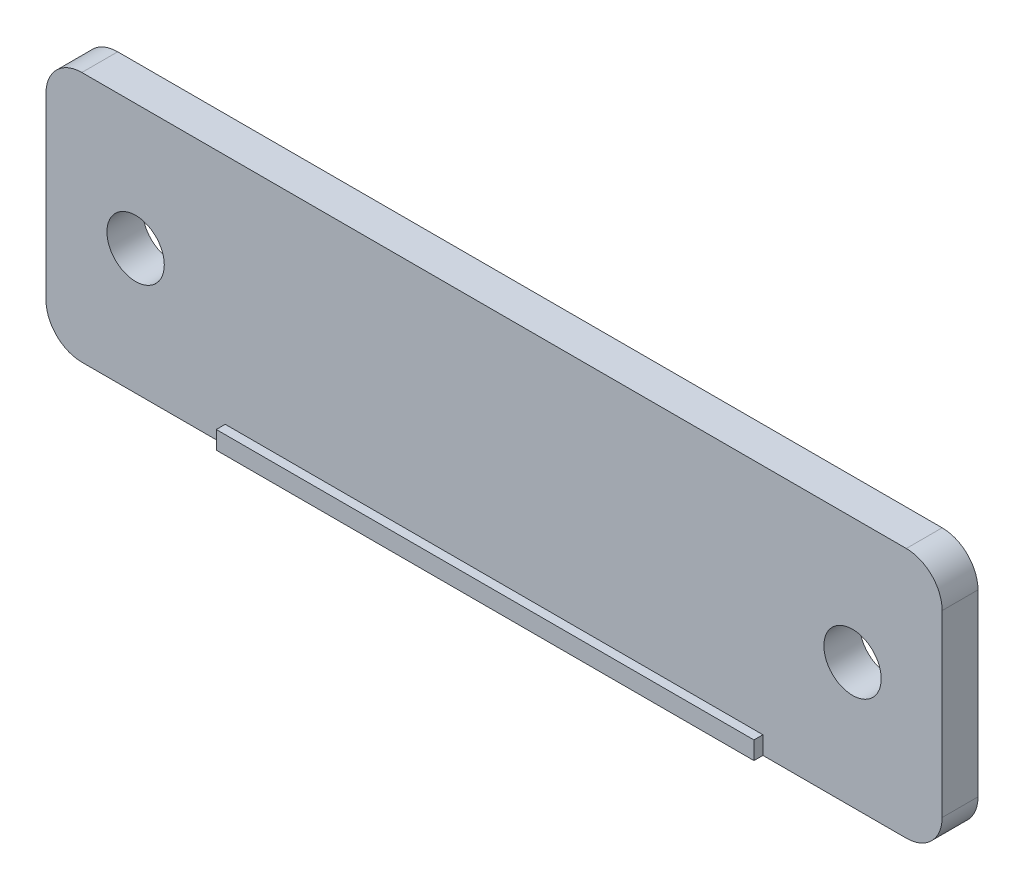
ISO-10303-21;
HEADER;
FILE_DESCRIPTION(('STEP AP214'),'2;1');
FILE_NAME('part.step','',(''),(''),'','','');
FILE_SCHEMA(('AUTOMOTIVE_DESIGN { 1 0 10303 214 1 1 1 1 }'));
ENDSEC;
DATA;
#1=APPLICATION_CONTEXT('core data for automotive mechanical design processes');
#2=APPLICATION_PROTOCOL_DEFINITION('international standard','automotive_design',2000,#1);
#3=PRODUCT_CONTEXT('',#1,'mechanical');
#4=PRODUCT('Part','Part','',(#3));
#5=PRODUCT_RELATED_PRODUCT_CATEGORY('part','',(#4));
#6=PRODUCT_DEFINITION_FORMATION('','',#4);
#7=PRODUCT_DEFINITION_CONTEXT('part definition',#1,'design');
#8=PRODUCT_DEFINITION('design','',#6,#7);
#9=PRODUCT_DEFINITION_SHAPE('','',#8);
#10=(LENGTH_UNIT() NAMED_UNIT(*) SI_UNIT(.MILLI.,.METRE.));
#11=(NAMED_UNIT(*) PLANE_ANGLE_UNIT() SI_UNIT($,.RADIAN.));
#12=(NAMED_UNIT(*) SI_UNIT($,.STERADIAN.) SOLID_ANGLE_UNIT());
#13=UNCERTAINTY_MEASURE_WITH_UNIT(LENGTH_MEASURE(1.E-05),#10,'distance_accuracy_value','');
#14=(GEOMETRIC_REPRESENTATION_CONTEXT(3) GLOBAL_UNCERTAINTY_ASSIGNED_CONTEXT((#13)) GLOBAL_UNIT_ASSIGNED_CONTEXT((#10,
#11,#12)) REPRESENTATION_CONTEXT('',''));
#15=CARTESIAN_POINT('',(0.,0.,0.));
#16=DIRECTION('',(0.,0.,1.));
#17=DIRECTION('',(1.,0.,0.));
#18=AXIS2_PLACEMENT_3D('',#15,#16,#17);
#19=CARTESIAN_POINT('',(25.,-6.99999999999999,2.5));
#20=DIRECTION('',(-1.,0.,0.));
#21=DIRECTION('',(0.,0.,1.));
#22=AXIS2_PLACEMENT_3D('',#19,#20,#21);
#23=PLANE('',#22);
#24=DIRECTION('',(0.,1.,0.));
#25=VECTOR('',#24,1.);
#26=CARTESIAN_POINT('',(25.,-6.99999999999999,2.));
#27=LINE('',#26,#25);
#28=CARTESIAN_POINT('',(25.,-4.99999999999999,2.));
#29=VERTEX_POINT('',#28);
#30=CARTESIAN_POINT('',(25.,4.99999999999999,2.));
#31=VERTEX_POINT('',#30);
#32=EDGE_CURVE('E162',#29,#31,#27,.T.);
#33=ORIENTED_EDGE('',*,*,#32,.F.);
#34=DIRECTION('',(0.,0.,-1.));
#35=VECTOR('',#34,1.);
#36=CARTESIAN_POINT('',(25.,-4.99999999999999,2.5));
#37=LINE('',#36,#35);
#38=CARTESIAN_POINT('',(25.,-4.99999999999999,0.));
#39=VERTEX_POINT('',#38);
#40=EDGE_CURVE('E215',#29,#39,#37,.T.);
#41=ORIENTED_EDGE('',*,*,#40,.T.);
#42=DIRECTION('',(0.,1.,0.));
#43=VECTOR('',#42,1.);
#44=CARTESIAN_POINT('',(25.,-6.99999999999999,0.));
#45=LINE('',#44,#43);
#46=CARTESIAN_POINT('',(25.,4.99999999999999,0.));
#47=VERTEX_POINT('',#46);
#48=EDGE_CURVE('E172',#39,#47,#45,.T.);
#49=ORIENTED_EDGE('',*,*,#48,.T.);
#50=DIRECTION('',(0.,0.,-1.));
#51=VECTOR('',#50,1.);
#52=CARTESIAN_POINT('',(25.,4.99999999999999,2.5));
#53=LINE('',#52,#51);
#54=EDGE_CURVE('E213',#47,#31,#53,.F.);
#55=ORIENTED_EDGE('',*,*,#54,.T.);
#56=EDGE_LOOP('',(#33,#41,#49,#55));
#57=FACE_BOUND('',#56,.T.);
#58=ADVANCED_FACE('F33',(#57),#23,.F.);
#59=CARTESIAN_POINT('',(-25.,6.99999999999999,2.5));
#60=DIRECTION('',(0.,-1.,0.));
#61=DIRECTION('',(1.,0.,0.));
#62=AXIS2_PLACEMENT_3D('',#59,#60,#61);
#63=PLANE('',#62);
#64=DIRECTION('',(-1.,0.,0.));
#65=VECTOR('',#64,1.);
#66=CARTESIAN_POINT('',(-25.,6.99999999999999,2.));
#67=LINE('',#66,#65);
#68=CARTESIAN_POINT('',(23.,6.99999999999999,2.));
#69=VERTEX_POINT('',#68);
#70=CARTESIAN_POINT('',(-23.,6.99999999999999,2.));
#71=VERTEX_POINT('',#70);
#72=EDGE_CURVE('E168',#69,#71,#67,.T.);
#73=ORIENTED_EDGE('',*,*,#72,.F.);
#74=DIRECTION('',(0.,0.,-1.));
#75=VECTOR('',#74,1.);
#76=CARTESIAN_POINT('',(23.,6.99999999999999,2.5));
#77=LINE('',#76,#75);
#78=CARTESIAN_POINT('',(23.,6.99999999999999,0.));
#79=VERTEX_POINT('',#78);
#80=EDGE_CURVE('E12',#69,#79,#77,.T.);
#81=ORIENTED_EDGE('',*,*,#80,.T.);
#82=DIRECTION('',(-1.,0.,0.));
#83=VECTOR('',#82,1.);
#84=CARTESIAN_POINT('',(-25.,6.99999999999999,0.));
#85=LINE('',#84,#83);
#86=CARTESIAN_POINT('',(-23.,6.99999999999999,0.));
#87=VERTEX_POINT('',#86);
#88=EDGE_CURVE('E180',#79,#87,#85,.T.);
#89=ORIENTED_EDGE('',*,*,#88,.T.);
#90=DIRECTION('',(0.,0.,-1.));
#91=VECTOR('',#90,1.);
#92=CARTESIAN_POINT('',(-23.,6.99999999999999,2.5));
#93=LINE('',#92,#91);
#94=EDGE_CURVE('E41',#87,#71,#93,.F.);
#95=ORIENTED_EDGE('',*,*,#94,.T.);
#96=EDGE_LOOP('',(#73,#81,#89,#95));
#97=FACE_BOUND('',#96,.T.);
#98=ADVANCED_FACE('F231',(#97),#63,.F.);
#99=CARTESIAN_POINT('',(-25.,-7.,2.5));
#100=DIRECTION('',(1.,0.,0.));
#101=DIRECTION('',(0.,0.,-1.));
#102=AXIS2_PLACEMENT_3D('',#99,#100,#101);
#103=PLANE('',#102);
#104=DIRECTION('',(0.,-1.,0.));
#105=VECTOR('',#104,1.);
#106=CARTESIAN_POINT('',(-25.,-7.,0.));
#107=LINE('',#106,#105);
#108=CARTESIAN_POINT('',(-25.,4.99999999999999,0.));
#109=VERTEX_POINT('',#108);
#110=CARTESIAN_POINT('',(-25.,-5.,0.));
#111=VERTEX_POINT('',#110);
#112=EDGE_CURVE('E182',#109,#111,#107,.T.);
#113=ORIENTED_EDGE('',*,*,#112,.T.);
#114=DIRECTION('',(0.,0.,-1.));
#115=VECTOR('',#114,1.);
#116=CARTESIAN_POINT('',(-25.,-5.,2.5));
#117=LINE('',#116,#115);
#118=CARTESIAN_POINT('',(-25.,-5.,2.));
#119=VERTEX_POINT('',#118);
#120=EDGE_CURVE('E204',#111,#119,#117,.F.);
#121=ORIENTED_EDGE('',*,*,#120,.T.);
#122=DIRECTION('',(0.,-1.,0.));
#123=VECTOR('',#122,1.);
#124=CARTESIAN_POINT('',(-25.,-7.,2.));
#125=LINE('',#124,#123);
#126=CARTESIAN_POINT('',(-25.,4.99999999999999,2.));
#127=VERTEX_POINT('',#126);
#128=EDGE_CURVE('E170',#127,#119,#125,.T.);
#129=ORIENTED_EDGE('',*,*,#128,.F.);
#130=DIRECTION('',(0.,0.,-1.));
#131=VECTOR('',#130,1.);
#132=CARTESIAN_POINT('',(-25.,4.99999999999999,2.5));
#133=LINE('',#132,#131);
#134=EDGE_CURVE('E201',#127,#109,#133,.T.);
#135=ORIENTED_EDGE('',*,*,#134,.T.);
#136=EDGE_LOOP('',(#113,#121,#129,#135));
#137=FACE_BOUND('',#136,.T.);
#138=ADVANCED_FACE('F238',(#137),#103,.F.);
#139=CARTESIAN_POINT('',(-25.,-7.,2.5));
#140=DIRECTION('',(0.,1.,0.));
#141=DIRECTION('',(-1.,0.,0.));
#142=AXIS2_PLACEMENT_3D('',#139,#140,#141);
#143=PLANE('',#142);
#144=DIRECTION('',(1.,0.,0.));
#145=VECTOR('',#144,1.);
#146=CARTESIAN_POINT('',(-25.,-7.,2.));
#147=LINE('',#146,#145);
#148=CARTESIAN_POINT('',(-23.,-7.,2.));
#149=VERTEX_POINT('',#148);
#150=CARTESIAN_POINT('',(-15.,-7.,2.));
#151=VERTEX_POINT('',#150);
#152=EDGE_CURVE('E144',#149,#151,#147,.T.);
#153=ORIENTED_EDGE('',*,*,#152,.F.);
#154=DIRECTION('',(0.,0.,-1.));
#155=VECTOR('',#154,1.);
#156=CARTESIAN_POINT('',(-23.,-7.,2.5));
#157=LINE('',#156,#155);
#158=CARTESIAN_POINT('',(-23.,-7.,0.));
#159=VERTEX_POINT('',#158);
#160=EDGE_CURVE('E190',#149,#159,#157,.T.);
#161=ORIENTED_EDGE('',*,*,#160,.T.);
#162=DIRECTION('',(1.,0.,0.));
#163=VECTOR('',#162,1.);
#164=CARTESIAN_POINT('',(-25.,-7.,0.));
#165=LINE('',#164,#163);
#166=CARTESIAN_POINT('',(23.,-6.99999999999999,0.));
#167=VERTEX_POINT('',#166);
#168=EDGE_CURVE('E177',#159,#167,#165,.T.);
#169=ORIENTED_EDGE('',*,*,#168,.T.);
#170=DIRECTION('',(0.,0.,-1.));
#171=VECTOR('',#170,1.);
#172=CARTESIAN_POINT('',(23.,-6.99999999999999,2.5));
#173=LINE('',#172,#171);
#174=CARTESIAN_POINT('',(23.,-6.99999999999999,2.));
#175=VERTEX_POINT('',#174);
#176=EDGE_CURVE('E188',#167,#175,#173,.F.);
#177=ORIENTED_EDGE('',*,*,#176,.T.);
#178=CARTESIAN_POINT('',(15.,-6.99999999999999,2.));
#179=VERTEX_POINT('',#178);
#180=EDGE_CURVE('E176',#179,#175,#147,.T.);
#181=ORIENTED_EDGE('',*,*,#180,.F.);
#182=DIRECTION('',(0.,0.,1.));
#183=VECTOR('',#182,1.);
#184=CARTESIAN_POINT('',(15.,-6.99999999999999,2.));
#185=LINE('',#184,#183);
#186=CARTESIAN_POINT('',(15.,-6.99999999999999,2.5));
#187=VERTEX_POINT('',#186);
#188=EDGE_CURVE('E163',#179,#187,#185,.T.);
#189=ORIENTED_EDGE('',*,*,#188,.T.);
#190=DIRECTION('',(1.,0.,0.));
#191=VECTOR('',#190,1.);
#192=CARTESIAN_POINT('',(-25.,-7.,2.5));
#193=LINE('',#192,#191);
#194=CARTESIAN_POINT('',(-15.,-7.,2.5));
#195=VERTEX_POINT('',#194);
#196=EDGE_CURVE('E173',#195,#187,#193,.T.);
#197=ORIENTED_EDGE('',*,*,#196,.F.);
#198=DIRECTION('',(0.,0.,1.));
#199=VECTOR('',#198,1.);
#200=CARTESIAN_POINT('',(-15.,-7.,2.));
#201=LINE('',#200,#199);
#202=EDGE_CURVE('E134',#151,#195,#201,.T.);
#203=ORIENTED_EDGE('',*,*,#202,.F.);
#204=EDGE_LOOP('',(#153,#161,#169,#177,#181,#189,#197,#203));
#205=FACE_BOUND('',#204,.T.);
#206=ADVANCED_FACE('F245',(#205),#143,.F.);
#207=CARTESIAN_POINT('',(0.,0.,2.5));
#208=DIRECTION('',(0.,0.,-1.));
#209=DIRECTION('',(-1.,0.,0.));
#210=AXIS2_PLACEMENT_3D('',#207,#208,#209);
#211=PLANE('',#210);
#212=DIRECTION('',(0.,1.,0.));
#213=VECTOR('',#212,1.);
#214=CARTESIAN_POINT('',(15.,-6.,2.5));
#215=LINE('',#214,#213);
#216=CARTESIAN_POINT('',(15.,-6.,2.5));
#217=VERTEX_POINT('',#216);
#218=EDGE_CURVE('E148',#187,#217,#215,.T.);
#219=ORIENTED_EDGE('',*,*,#218,.T.);
#220=DIRECTION('',(-1.,0.,0.));
#221=VECTOR('',#220,1.);
#222=CARTESIAN_POINT('',(15.,-6.,2.5));
#223=LINE('',#222,#221);
#224=CARTESIAN_POINT('',(-15.,-6.,2.5));
#225=VERTEX_POINT('',#224);
#226=EDGE_CURVE('E157',#217,#225,#223,.T.);
#227=ORIENTED_EDGE('',*,*,#226,.T.);
#228=DIRECTION('',(0.,-1.,0.));
#229=VECTOR('',#228,1.);
#230=CARTESIAN_POINT('',(-15.,-6.,2.5));
#231=LINE('',#230,#229);
#232=EDGE_CURVE('E129',#225,#195,#231,.T.);
#233=ORIENTED_EDGE('',*,*,#232,.T.);
#234=ORIENTED_EDGE('',*,*,#196,.T.);
#235=EDGE_LOOP('',(#219,#227,#233,#234));
#236=FACE_BOUND('',#235,.T.);
#237=ADVANCED_FACE('F249',(#236),#211,.F.);
#238=CARTESIAN_POINT('',(0.,0.,0.));
#239=DIRECTION('',(0.,0.,-1.));
#240=DIRECTION('',(-1.,0.,0.));
#241=AXIS2_PLACEMENT_3D('',#238,#239,#240);
#242=PLANE('',#241);
#243=CARTESIAN_POINT('',(-20.,0.,0.));
#244=DIRECTION('',(0.,0.,1.));
#245=DIRECTION('',(1.,0.,0.));
#246=AXIS2_PLACEMENT_3D('',#243,#244,#245);
#247=CIRCLE('',#246,1.6);
#248=CARTESIAN_POINT('',(-18.4,0.,0.));
#249=VERTEX_POINT('',#248);
#250=EDGE_CURVE('E159',#249,#249,#247,.T.);
#251=ORIENTED_EDGE('',*,*,#250,.T.);
#252=EDGE_LOOP('',(#251));
#253=FACE_BOUND('',#252,.T.);
#254=CARTESIAN_POINT('',(20.,0.,0.));
#255=DIRECTION('',(0.,0.,1.));
#256=DIRECTION('',(1.,0.,0.));
#257=AXIS2_PLACEMENT_3D('',#254,#255,#256);
#258=CIRCLE('',#257,1.6);
#259=CARTESIAN_POINT('',(21.6,0.,0.));
#260=VERTEX_POINT('',#259);
#261=EDGE_CURVE('E302',#260,#260,#258,.T.);
#262=ORIENTED_EDGE('',*,*,#261,.T.);
#263=EDGE_LOOP('',(#262));
#264=FACE_BOUND('',#263,.T.);
#265=ORIENTED_EDGE('',*,*,#168,.F.);
#266=CARTESIAN_POINT('',(-23.,-5.,0.));
#267=DIRECTION('',(0.,0.,-1.));
#268=DIRECTION('',(-1.,0.,0.));
#269=AXIS2_PLACEMENT_3D('',#266,#267,#268);
#270=CIRCLE('',#269,2.);
#271=EDGE_CURVE('E199',#159,#111,#270,.T.);
#272=ORIENTED_EDGE('',*,*,#271,.T.);
#273=ORIENTED_EDGE('',*,*,#112,.F.);
#274=CARTESIAN_POINT('',(-23.,4.99999999999999,0.));
#275=DIRECTION('',(0.,0.,-1.));
#276=DIRECTION('',(-1.,0.,0.));
#277=AXIS2_PLACEMENT_3D('',#274,#275,#276);
#278=CIRCLE('',#277,2.);
#279=EDGE_CURVE('E193',#109,#87,#278,.T.);
#280=ORIENTED_EDGE('',*,*,#279,.T.);
#281=ORIENTED_EDGE('',*,*,#88,.F.);
#282=CARTESIAN_POINT('',(23.,4.99999999999999,0.));
#283=DIRECTION('',(0.,0.,-1.));
#284=DIRECTION('',(-1.,0.,0.));
#285=AXIS2_PLACEMENT_3D('',#282,#283,#284);
#286=CIRCLE('',#285,2.);
#287=EDGE_CURVE('E195',#79,#47,#286,.T.);
#288=ORIENTED_EDGE('',*,*,#287,.T.);
#289=ORIENTED_EDGE('',*,*,#48,.F.);
#290=CARTESIAN_POINT('',(23.,-4.99999999999999,0.));
#291=DIRECTION('',(0.,0.,-1.));
#292=DIRECTION('',(-1.,0.,0.));
#293=AXIS2_PLACEMENT_3D('',#290,#291,#292);
#294=CIRCLE('',#293,2.);
#295=EDGE_CURVE('E197',#39,#167,#294,.T.);
#296=ORIENTED_EDGE('',*,*,#295,.T.);
#297=EDGE_LOOP('',(#265,#272,#273,#280,#281,#288,#289,#296));
#298=FACE_BOUND('',#297,.T.);
#299=ADVANCED_FACE('F226',(#253,#264,#298),#242,.T.);
#300=CARTESIAN_POINT('',(0.,0.,2.));
#301=DIRECTION('',(0.,0.,1.));
#302=DIRECTION('',(1.,0.,0.));
#303=AXIS2_PLACEMENT_3D('',#300,#301,#302);
#304=PLANE('',#303);
#305=CARTESIAN_POINT('',(-20.,0.,2.));
#306=DIRECTION('',(0.,0.,1.));
#307=DIRECTION('',(1.,0.,0.));
#308=AXIS2_PLACEMENT_3D('',#305,#306,#307);
#309=CIRCLE('',#308,1.6);
#310=CARTESIAN_POINT('',(-18.4,0.,2.));
#311=VERTEX_POINT('',#310);
#312=EDGE_CURVE('E301',#311,#311,#309,.T.);
#313=ORIENTED_EDGE('',*,*,#312,.F.);
#314=EDGE_LOOP('',(#313));
#315=FACE_BOUND('',#314,.T.);
#316=CARTESIAN_POINT('',(20.,0.,2.));
#317=DIRECTION('',(0.,0.,1.));
#318=DIRECTION('',(1.,0.,0.));
#319=AXIS2_PLACEMENT_3D('',#316,#317,#318);
#320=CIRCLE('',#319,1.6);
#321=CARTESIAN_POINT('',(21.6,0.,2.));
#322=VERTEX_POINT('',#321);
#323=EDGE_CURVE('E153',#322,#322,#320,.T.);
#324=ORIENTED_EDGE('',*,*,#323,.F.);
#325=EDGE_LOOP('',(#324));
#326=FACE_BOUND('',#325,.T.);
#327=ORIENTED_EDGE('',*,*,#128,.T.);
#328=CARTESIAN_POINT('',(-23.,-5.,2.));
#329=DIRECTION('',(0.,0.,1.));
#330=DIRECTION('',(1.,0.,0.));
#331=AXIS2_PLACEMENT_3D('',#328,#329,#330);
#332=CIRCLE('',#331,2.);
#333=EDGE_CURVE('E211',#119,#149,#332,.T.);
#334=ORIENTED_EDGE('',*,*,#333,.T.);
#335=ORIENTED_EDGE('',*,*,#152,.T.);
#336=DIRECTION('',(0.,-1.,0.));
#337=VECTOR('',#336,1.);
#338=CARTESIAN_POINT('',(-15.,-6.,2.));
#339=LINE('',#338,#337);
#340=CARTESIAN_POINT('',(-15.,-6.,2.));
#341=VERTEX_POINT('',#340);
#342=EDGE_CURVE('E126',#341,#151,#339,.T.);
#343=ORIENTED_EDGE('',*,*,#342,.F.);
#344=DIRECTION('',(-1.,0.,0.));
#345=VECTOR('',#344,1.);
#346=CARTESIAN_POINT('',(15.,-6.,2.));
#347=LINE('',#346,#345);
#348=CARTESIAN_POINT('',(15.,-6.,2.));
#349=VERTEX_POINT('',#348);
#350=EDGE_CURVE('E141',#349,#341,#347,.T.);
#351=ORIENTED_EDGE('',*,*,#350,.F.);
#352=DIRECTION('',(0.,1.,0.));
#353=VECTOR('',#352,1.);
#354=CARTESIAN_POINT('',(15.,-6.,2.));
#355=LINE('',#354,#353);
#356=EDGE_CURVE('E135',#179,#349,#355,.T.);
#357=ORIENTED_EDGE('',*,*,#356,.F.);
#358=ORIENTED_EDGE('',*,*,#180,.T.);
#359=CARTESIAN_POINT('',(23.,-4.99999999999999,2.));
#360=DIRECTION('',(0.,0.,1.));
#361=DIRECTION('',(1.,0.,0.));
#362=AXIS2_PLACEMENT_3D('',#359,#360,#361);
#363=CIRCLE('',#362,2.);
#364=EDGE_CURVE('E209',#175,#29,#363,.T.);
#365=ORIENTED_EDGE('',*,*,#364,.T.);
#366=ORIENTED_EDGE('',*,*,#32,.T.);
#367=CARTESIAN_POINT('',(23.,4.99999999999999,2.));
#368=DIRECTION('',(0.,0.,1.));
#369=DIRECTION('',(1.,0.,0.));
#370=AXIS2_PLACEMENT_3D('',#367,#368,#369);
#371=CIRCLE('',#370,2.);
#372=EDGE_CURVE('E54',#31,#69,#371,.T.);
#373=ORIENTED_EDGE('',*,*,#372,.T.);
#374=ORIENTED_EDGE('',*,*,#72,.T.);
#375=CARTESIAN_POINT('',(-23.,4.99999999999999,2.));
#376=DIRECTION('',(0.,0.,1.));
#377=DIRECTION('',(1.,0.,0.));
#378=AXIS2_PLACEMENT_3D('',#375,#376,#377);
#379=CIRCLE('',#378,2.);
#380=EDGE_CURVE('E206',#71,#127,#379,.T.);
#381=ORIENTED_EDGE('',*,*,#380,.T.);
#382=EDGE_LOOP('',(#327,#334,#335,#343,#351,#357,#358,#365,#366,#373,#374,#381));
#383=FACE_BOUND('',#382,.T.);
#384=ADVANCED_FACE('F139',(#315,#326,#383),#304,.T.);
#385=CARTESIAN_POINT('',(15.,-6.,2.));
#386=DIRECTION('',(0.,1.,0.));
#387=DIRECTION('',(-1.,0.,0.));
#388=AXIS2_PLACEMENT_3D('',#385,#386,#387);
#389=PLANE('',#388);
#390=ORIENTED_EDGE('',*,*,#226,.F.);
#391=DIRECTION('',(0.,0.,1.));
#392=VECTOR('',#391,1.);
#393=CARTESIAN_POINT('',(15.,-6.,2.));
#394=LINE('',#393,#392);
#395=EDGE_CURVE('E147',#349,#217,#394,.T.);
#396=ORIENTED_EDGE('',*,*,#395,.F.);
#397=ORIENTED_EDGE('',*,*,#350,.T.);
#398=DIRECTION('',(0.,0.,1.));
#399=VECTOR('',#398,1.);
#400=CARTESIAN_POINT('',(-15.,-6.,2.));
#401=LINE('',#400,#399);
#402=EDGE_CURVE('E123',#341,#225,#401,.T.);
#403=ORIENTED_EDGE('',*,*,#402,.T.);
#404=EDGE_LOOP('',(#390,#396,#397,#403));
#405=FACE_BOUND('',#404,.T.);
#406=ADVANCED_FACE('F146',(#405),#389,.T.);
#407=CARTESIAN_POINT('',(15.,-6.,2.));
#408=DIRECTION('',(1.,0.,0.));
#409=DIRECTION('',(0.,0.,-1.));
#410=AXIS2_PLACEMENT_3D('',#407,#408,#409);
#411=PLANE('',#410);
#412=ORIENTED_EDGE('',*,*,#218,.F.);
#413=ORIENTED_EDGE('',*,*,#188,.F.);
#414=ORIENTED_EDGE('',*,*,#356,.T.);
#415=ORIENTED_EDGE('',*,*,#395,.T.);
#416=EDGE_LOOP('',(#412,#413,#414,#415));
#417=FACE_BOUND('',#416,.T.);
#418=ADVANCED_FACE('F251',(#417),#411,.T.);
#419=CARTESIAN_POINT('',(-15.,-6.,2.));
#420=DIRECTION('',(-1.,0.,0.));
#421=DIRECTION('',(0.,0.,1.));
#422=AXIS2_PLACEMENT_3D('',#419,#420,#421);
#423=PLANE('',#422);
#424=ORIENTED_EDGE('',*,*,#232,.F.);
#425=ORIENTED_EDGE('',*,*,#402,.F.);
#426=ORIENTED_EDGE('',*,*,#342,.T.);
#427=ORIENTED_EDGE('',*,*,#202,.T.);
#428=EDGE_LOOP('',(#424,#425,#426,#427));
#429=FACE_BOUND('',#428,.T.);
#430=ADVANCED_FACE('F125',(#429),#423,.T.);
#431=CARTESIAN_POINT('',(20.,0.,0.));
#432=DIRECTION('',(0.,0.,1.));
#433=DIRECTION('',(1.,0.,0.));
#434=AXIS2_PLACEMENT_3D('',#431,#432,#433);
#435=CYLINDRICAL_SURFACE('',#434,1.6);
#436=ORIENTED_EDGE('',*,*,#261,.F.);
#437=EDGE_LOOP('',(#436));
#438=FACE_BOUND('',#437,.T.);
#439=ORIENTED_EDGE('',*,*,#323,.T.);
#440=EDGE_LOOP('',(#439));
#441=FACE_BOUND('',#440,.T.);
#442=ADVANCED_FACE('F287',(#438,#441),#435,.F.);
#443=CARTESIAN_POINT('',(-20.,0.,0.));
#444=DIRECTION('',(0.,0.,1.));
#445=DIRECTION('',(1.,0.,0.));
#446=AXIS2_PLACEMENT_3D('',#443,#444,#445);
#447=CYLINDRICAL_SURFACE('',#446,1.6);
#448=ORIENTED_EDGE('',*,*,#250,.F.);
#449=EDGE_LOOP('',(#448));
#450=FACE_BOUND('',#449,.T.);
#451=ORIENTED_EDGE('',*,*,#312,.T.);
#452=EDGE_LOOP('',(#451));
#453=FACE_BOUND('',#452,.T.);
#454=ADVANCED_FACE('F261',(#450,#453),#447,.F.);
#455=CARTESIAN_POINT('',(-23.,-5.,2.5));
#456=DIRECTION('',(0.,0.,-1.));
#457=DIRECTION('',(-1.,0.,0.));
#458=AXIS2_PLACEMENT_3D('',#455,#456,#457);
#459=CYLINDRICAL_SURFACE('',#458,2.);
#460=ORIENTED_EDGE('',*,*,#333,.F.);
#461=ORIENTED_EDGE('',*,*,#120,.F.);
#462=ORIENTED_EDGE('',*,*,#271,.F.);
#463=ORIENTED_EDGE('',*,*,#160,.F.);
#464=EDGE_LOOP('',(#460,#461,#462,#463));
#465=FACE_BOUND('',#464,.T.);
#466=ADVANCED_FACE('F243',(#465),#459,.T.);
#467=CARTESIAN_POINT('',(23.,-4.99999999999999,2.5));
#468=DIRECTION('',(0.,0.,-1.));
#469=DIRECTION('',(-1.,0.,0.));
#470=AXIS2_PLACEMENT_3D('',#467,#468,#469);
#471=CYLINDRICAL_SURFACE('',#470,2.);
#472=ORIENTED_EDGE('',*,*,#364,.F.);
#473=ORIENTED_EDGE('',*,*,#176,.F.);
#474=ORIENTED_EDGE('',*,*,#295,.F.);
#475=ORIENTED_EDGE('',*,*,#40,.F.);
#476=EDGE_LOOP('',(#472,#473,#474,#475));
#477=FACE_BOUND('',#476,.T.);
#478=ADVANCED_FACE('F254',(#477),#471,.T.);
#479=CARTESIAN_POINT('',(23.,4.99999999999999,2.5));
#480=DIRECTION('',(0.,0.,-1.));
#481=DIRECTION('',(-1.,0.,0.));
#482=AXIS2_PLACEMENT_3D('',#479,#480,#481);
#483=CYLINDRICAL_SURFACE('',#482,2.);
#484=ORIENTED_EDGE('',*,*,#372,.F.);
#485=ORIENTED_EDGE('',*,*,#54,.F.);
#486=ORIENTED_EDGE('',*,*,#287,.F.);
#487=ORIENTED_EDGE('',*,*,#80,.F.);
#488=EDGE_LOOP('',(#484,#485,#486,#487));
#489=FACE_BOUND('',#488,.T.);
#490=ADVANCED_FACE('F230',(#489),#483,.T.);
#491=CARTESIAN_POINT('',(-23.,4.99999999999999,2.5));
#492=DIRECTION('',(0.,0.,-1.));
#493=DIRECTION('',(-1.,0.,0.));
#494=AXIS2_PLACEMENT_3D('',#491,#492,#493);
#495=CYLINDRICAL_SURFACE('',#494,2.);
#496=ORIENTED_EDGE('',*,*,#380,.F.);
#497=ORIENTED_EDGE('',*,*,#94,.F.);
#498=ORIENTED_EDGE('',*,*,#279,.F.);
#499=ORIENTED_EDGE('',*,*,#134,.F.);
#500=EDGE_LOOP('',(#496,#497,#498,#499));
#501=FACE_BOUND('',#500,.T.);
#502=ADVANCED_FACE('F35',(#501),#495,.T.);
#503=CLOSED_SHELL('',(#58,#98,#138,#206,#237,#299,#384,#406,#418,#430,#442,#454,#466,#478,#490,#502));
#504=MANIFOLD_SOLID_BREP('B2',#503);
#505=ADVANCED_BREP_SHAPE_REPRESENTATION('',(#18,#504),#14);
#506=SHAPE_DEFINITION_REPRESENTATION(#9,#505);
ENDSEC;
END-ISO-10303-21;
